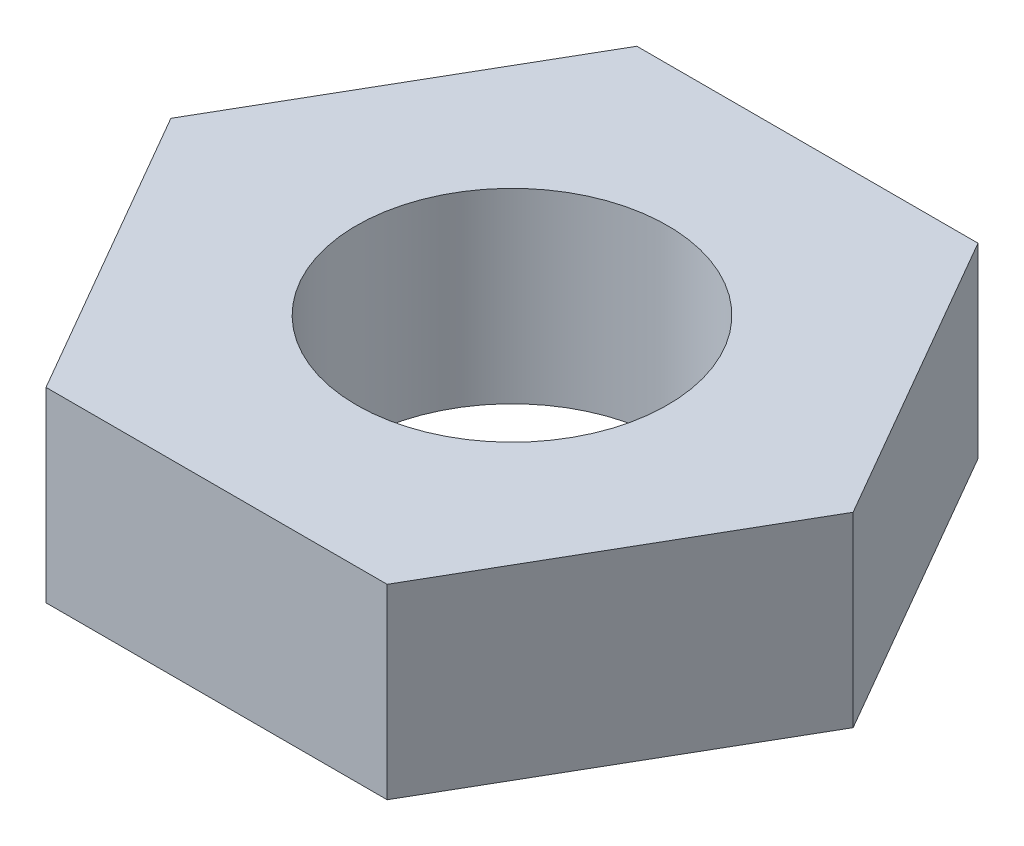
ISO-10303-21;
HEADER;
FILE_DESCRIPTION(('STEP AP214'),'2;1');
FILE_NAME('part.step','',(''),(''),'','','');
FILE_SCHEMA(('AUTOMOTIVE_DESIGN { 1 0 10303 214 1 1 1 1 }'));
ENDSEC;
DATA;
#1=APPLICATION_CONTEXT('core data for automotive mechanical design processes');
#2=APPLICATION_PROTOCOL_DEFINITION('international standard','automotive_design',2000,#1);
#3=PRODUCT_CONTEXT('',#1,'mechanical');
#4=PRODUCT('Part','Part','',(#3));
#5=PRODUCT_RELATED_PRODUCT_CATEGORY('part','',(#4));
#6=PRODUCT_DEFINITION_FORMATION('','',#4);
#7=PRODUCT_DEFINITION_CONTEXT('part definition',#1,'design');
#8=PRODUCT_DEFINITION('design','',#6,#7);
#9=PRODUCT_DEFINITION_SHAPE('','',#8);
#10=(LENGTH_UNIT() NAMED_UNIT(*) SI_UNIT(.MILLI.,.METRE.));
#11=(NAMED_UNIT(*) PLANE_ANGLE_UNIT() SI_UNIT($,.RADIAN.));
#12=(NAMED_UNIT(*) SI_UNIT($,.STERADIAN.) SOLID_ANGLE_UNIT());
#13=UNCERTAINTY_MEASURE_WITH_UNIT(LENGTH_MEASURE(1.E-05),#10,'distance_accuracy_value','');
#14=(GEOMETRIC_REPRESENTATION_CONTEXT(3) GLOBAL_UNCERTAINTY_ASSIGNED_CONTEXT((#13)) GLOBAL_UNIT_ASSIGNED_CONTEXT((#10,
#11,#12)) REPRESENTATION_CONTEXT('',''));
#15=CARTESIAN_POINT('',(0.,0.,0.));
#16=DIRECTION('',(0.,0.,1.));
#17=DIRECTION('',(1.,0.,0.));
#18=AXIS2_PLACEMENT_3D('',#15,#16,#17);
#19=CARTESIAN_POINT('',(0.,1.2,0.));
#20=DIRECTION('',(0.,1.,0.));
#21=DIRECTION('',(0.,0.,1.));
#22=AXIS2_PLACEMENT_3D('',#19,#20,#21);
#23=PLANE('',#22);
#24=DIRECTION('',(-0.5,0.,-0.866025403784438));
#25=VECTOR('',#24,1.);
#26=CARTESIAN_POINT('',(2.19393102292058,1.2,0.));
#27=LINE('',#26,#25);
#28=CARTESIAN_POINT('',(2.19393102292058,1.2,0.));
#29=VERTEX_POINT('',#28);
#30=CARTESIAN_POINT('',(1.09696551146029,1.2,-1.9));
#31=VERTEX_POINT('',#30);
#32=EDGE_CURVE('E128',#29,#31,#27,.T.);
#33=ORIENTED_EDGE('',*,*,#32,.T.);
#34=DIRECTION('',(-1.,0.,0.));
#35=VECTOR('',#34,1.);
#36=CARTESIAN_POINT('',(1.09696551146029,1.2,-1.9));
#37=LINE('',#36,#35);
#38=CARTESIAN_POINT('',(-1.09696551146029,1.2,-1.9));
#39=VERTEX_POINT('',#38);
#40=EDGE_CURVE('E86',#31,#39,#37,.T.);
#41=ORIENTED_EDGE('',*,*,#40,.T.);
#42=DIRECTION('',(-0.5,0.,0.866025403784439));
#43=VECTOR('',#42,1.);
#44=CARTESIAN_POINT('',(-1.09696551146029,1.2,-1.9));
#45=LINE('',#44,#43);
#46=CARTESIAN_POINT('',(-2.19393102292058,1.2,0.));
#47=VERTEX_POINT('',#46);
#48=EDGE_CURVE('E99',#39,#47,#45,.T.);
#49=ORIENTED_EDGE('',*,*,#48,.T.);
#50=DIRECTION('',(0.5,0.,0.866025403784439));
#51=VECTOR('',#50,1.);
#52=CARTESIAN_POINT('',(-2.19393102292058,1.2,0.));
#53=LINE('',#52,#51);
#54=CARTESIAN_POINT('',(-1.09696551146029,1.2,1.9));
#55=VERTEX_POINT('',#54);
#56=EDGE_CURVE('E93',#47,#55,#53,.T.);
#57=ORIENTED_EDGE('',*,*,#56,.T.);
#58=DIRECTION('',(1.,0.,0.));
#59=VECTOR('',#58,1.);
#60=CARTESIAN_POINT('',(-1.09696551146029,1.2,1.9));
#61=LINE('',#60,#59);
#62=CARTESIAN_POINT('',(1.09696551146029,1.2,1.9));
#63=VERTEX_POINT('',#62);
#64=EDGE_CURVE('E97',#55,#63,#61,.T.);
#65=ORIENTED_EDGE('',*,*,#64,.T.);
#66=DIRECTION('',(0.5,0.,-0.866025403784439));
#67=VECTOR('',#66,1.);
#68=CARTESIAN_POINT('',(1.09696551146029,1.2,1.9));
#69=LINE('',#68,#67);
#70=EDGE_CURVE('E49',#63,#29,#69,.T.);
#71=ORIENTED_EDGE('',*,*,#70,.T.);
#72=EDGE_LOOP('',(#33,#41,#49,#57,#65,#71));
#73=FACE_BOUND('',#72,.T.);
#74=CARTESIAN_POINT('',(0.,1.2,0.));
#75=DIRECTION('',(0.,1.,0.));
#76=DIRECTION('',(0.,0.,1.));
#77=AXIS2_PLACEMENT_3D('',#74,#75,#76);
#78=CIRCLE('',#77,1.);
#79=CARTESIAN_POINT('',(0.,1.2,1.));
#80=VERTEX_POINT('',#79);
#81=EDGE_CURVE('E121',#80,#80,#78,.T.);
#82=ORIENTED_EDGE('',*,*,#81,.F.);
#83=EDGE_LOOP('',(#82));
#84=FACE_BOUND('',#83,.T.);
#85=ADVANCED_FACE('F32',(#73,#84),#23,.T.);
#86=CARTESIAN_POINT('',(0.,0.,0.));
#87=DIRECTION('',(0.,1.,0.));
#88=DIRECTION('',(0.,0.,1.));
#89=AXIS2_PLACEMENT_3D('',#86,#87,#88);
#90=PLANE('',#89);
#91=DIRECTION('',(-0.5,0.,-0.866025403784438));
#92=VECTOR('',#91,1.);
#93=CARTESIAN_POINT('',(2.19393102292058,0.,0.));
#94=LINE('',#93,#92);
#95=CARTESIAN_POINT('',(2.19393102292058,0.,0.));
#96=VERTEX_POINT('',#95);
#97=CARTESIAN_POINT('',(1.09696551146029,0.,-1.9));
#98=VERTEX_POINT('',#97);
#99=EDGE_CURVE('E117',#96,#98,#94,.T.);
#100=ORIENTED_EDGE('',*,*,#99,.F.);
#101=DIRECTION('',(0.5,0.,-0.866025403784439));
#102=VECTOR('',#101,1.);
#103=CARTESIAN_POINT('',(1.09696551146029,0.,1.9));
#104=LINE('',#103,#102);
#105=CARTESIAN_POINT('',(1.09696551146029,0.,1.9));
#106=VERTEX_POINT('',#105);
#107=EDGE_CURVE('E78',#106,#96,#104,.T.);
#108=ORIENTED_EDGE('',*,*,#107,.F.);
#109=DIRECTION('',(1.,0.,0.));
#110=VECTOR('',#109,1.);
#111=CARTESIAN_POINT('',(-1.09696551146029,0.,1.9));
#112=LINE('',#111,#110);
#113=CARTESIAN_POINT('',(-1.09696551146029,0.,1.9));
#114=VERTEX_POINT('',#113);
#115=EDGE_CURVE('E72',#114,#106,#112,.T.);
#116=ORIENTED_EDGE('',*,*,#115,.F.);
#117=DIRECTION('',(0.5,0.,0.866025403784439));
#118=VECTOR('',#117,1.);
#119=CARTESIAN_POINT('',(-2.19393102292058,0.,0.));
#120=LINE('',#119,#118);
#121=CARTESIAN_POINT('',(-2.19393102292058,0.,0.));
#122=VERTEX_POINT('',#121);
#123=EDGE_CURVE('E107',#122,#114,#120,.T.);
#124=ORIENTED_EDGE('',*,*,#123,.F.);
#125=DIRECTION('',(-0.5,0.,0.866025403784439));
#126=VECTOR('',#125,1.);
#127=CARTESIAN_POINT('',(-1.09696551146029,0.,-1.9));
#128=LINE('',#127,#126);
#129=CARTESIAN_POINT('',(-1.09696551146029,0.,-1.9));
#130=VERTEX_POINT('',#129);
#131=EDGE_CURVE('E123',#130,#122,#128,.T.);
#132=ORIENTED_EDGE('',*,*,#131,.F.);
#133=DIRECTION('',(-1.,0.,0.));
#134=VECTOR('',#133,1.);
#135=CARTESIAN_POINT('',(1.09696551146029,0.,-1.9));
#136=LINE('',#135,#134);
#137=EDGE_CURVE('E120',#98,#130,#136,.T.);
#138=ORIENTED_EDGE('',*,*,#137,.F.);
#139=EDGE_LOOP('',(#100,#108,#116,#124,#132,#138));
#140=FACE_BOUND('',#139,.T.);
#141=CARTESIAN_POINT('',(0.,0.,0.));
#142=DIRECTION('',(0.,1.,0.));
#143=DIRECTION('',(0.,0.,1.));
#144=AXIS2_PLACEMENT_3D('',#141,#142,#143);
#145=CIRCLE('',#144,1.);
#146=CARTESIAN_POINT('',(0.,0.,1.));
#147=VERTEX_POINT('',#146);
#148=EDGE_CURVE('E221',#147,#147,#145,.T.);
#149=ORIENTED_EDGE('',*,*,#148,.T.);
#150=EDGE_LOOP('',(#149));
#151=FACE_BOUND('',#150,.T.);
#152=ADVANCED_FACE('F137',(#140,#151),#90,.F.);
#153=CARTESIAN_POINT('',(2.19393102292058,1.2,0.));
#154=DIRECTION('',(-0.866025403784438,0.,0.5));
#155=DIRECTION('',(0.5,0.,0.866025403784439));
#156=AXIS2_PLACEMENT_3D('',#153,#154,#155);
#157=PLANE('',#156);
#158=ORIENTED_EDGE('',*,*,#99,.T.);
#159=DIRECTION('',(0.,-1.,0.));
#160=VECTOR('',#159,1.);
#161=CARTESIAN_POINT('',(1.09696551146029,1.2,-1.9));
#162=LINE('',#161,#160);
#163=EDGE_CURVE('E11',#31,#98,#162,.T.);
#164=ORIENTED_EDGE('',*,*,#163,.F.);
#165=ORIENTED_EDGE('',*,*,#32,.F.);
#166=DIRECTION('',(0.,-1.,0.));
#167=VECTOR('',#166,1.);
#168=CARTESIAN_POINT('',(2.19393102292058,1.2,0.));
#169=LINE('',#168,#167);
#170=EDGE_CURVE('E113',#29,#96,#169,.T.);
#171=ORIENTED_EDGE('',*,*,#170,.T.);
#172=EDGE_LOOP('',(#158,#164,#165,#171));
#173=FACE_BOUND('',#172,.T.);
#174=ADVANCED_FACE('F34',(#173),#157,.F.);
#175=CARTESIAN_POINT('',(1.09696551146029,1.2,-1.9));
#176=DIRECTION('',(0.,0.,1.));
#177=DIRECTION('',(1.,0.,0.));
#178=AXIS2_PLACEMENT_3D('',#175,#176,#177);
#179=PLANE('',#178);
#180=ORIENTED_EDGE('',*,*,#137,.T.);
#181=DIRECTION('',(0.,-1.,0.));
#182=VECTOR('',#181,1.);
#183=CARTESIAN_POINT('',(-1.09696551146029,1.2,-1.9));
#184=LINE('',#183,#182);
#185=EDGE_CURVE('E41',#39,#130,#184,.T.);
#186=ORIENTED_EDGE('',*,*,#185,.F.);
#187=ORIENTED_EDGE('',*,*,#40,.F.);
#188=ORIENTED_EDGE('',*,*,#163,.T.);
#189=EDGE_LOOP('',(#180,#186,#187,#188));
#190=FACE_BOUND('',#189,.T.);
#191=ADVANCED_FACE('F162',(#190),#179,.F.);
#192=CARTESIAN_POINT('',(-1.09696551146029,1.2,-1.9));
#193=DIRECTION('',(0.866025403784439,0.,0.5));
#194=DIRECTION('',(0.5,0.,-0.866025403784439));
#195=AXIS2_PLACEMENT_3D('',#192,#193,#194);
#196=PLANE('',#195);
#197=ORIENTED_EDGE('',*,*,#131,.T.);
#198=DIRECTION('',(0.,-1.,0.));
#199=VECTOR('',#198,1.);
#200=CARTESIAN_POINT('',(-2.19393102292058,1.2,0.));
#201=LINE('',#200,#199);
#202=EDGE_CURVE('E108',#47,#122,#201,.T.);
#203=ORIENTED_EDGE('',*,*,#202,.F.);
#204=ORIENTED_EDGE('',*,*,#48,.F.);
#205=ORIENTED_EDGE('',*,*,#185,.T.);
#206=EDGE_LOOP('',(#197,#203,#204,#205));
#207=FACE_BOUND('',#206,.T.);
#208=ADVANCED_FACE('F134',(#207),#196,.F.);
#209=CARTESIAN_POINT('',(-2.19393102292058,1.2,0.));
#210=DIRECTION('',(0.866025403784439,0.,-0.5));
#211=DIRECTION('',(-0.5,0.,-0.866025403784439));
#212=AXIS2_PLACEMENT_3D('',#209,#210,#211);
#213=PLANE('',#212);
#214=ORIENTED_EDGE('',*,*,#123,.T.);
#215=DIRECTION('',(0.,-1.,0.));
#216=VECTOR('',#215,1.);
#217=CARTESIAN_POINT('',(-1.09696551146029,1.2,1.9));
#218=LINE('',#217,#216);
#219=EDGE_CURVE('E104',#55,#114,#218,.T.);
#220=ORIENTED_EDGE('',*,*,#219,.F.);
#221=ORIENTED_EDGE('',*,*,#56,.F.);
#222=ORIENTED_EDGE('',*,*,#202,.T.);
#223=EDGE_LOOP('',(#214,#220,#221,#222));
#224=FACE_BOUND('',#223,.T.);
#225=ADVANCED_FACE('F105',(#224),#213,.F.);
#226=CARTESIAN_POINT('',(-1.09696551146029,1.2,1.9));
#227=DIRECTION('',(0.,0.,-1.));
#228=DIRECTION('',(-1.,0.,0.));
#229=AXIS2_PLACEMENT_3D('',#226,#227,#228);
#230=PLANE('',#229);
#231=ORIENTED_EDGE('',*,*,#115,.T.);
#232=DIRECTION('',(0.,-1.,0.));
#233=VECTOR('',#232,1.);
#234=CARTESIAN_POINT('',(1.09696551146029,1.2,1.9));
#235=LINE('',#234,#233);
#236=EDGE_CURVE('E109',#63,#106,#235,.T.);
#237=ORIENTED_EDGE('',*,*,#236,.F.);
#238=ORIENTED_EDGE('',*,*,#64,.F.);
#239=ORIENTED_EDGE('',*,*,#219,.T.);
#240=EDGE_LOOP('',(#231,#237,#238,#239));
#241=FACE_BOUND('',#240,.T.);
#242=ADVANCED_FACE('F111',(#241),#230,.F.);
#243=CARTESIAN_POINT('',(1.09696551146029,1.2,1.9));
#244=DIRECTION('',(-0.866025403784439,0.,-0.5));
#245=DIRECTION('',(-0.5,0.,0.866025403784439));
#246=AXIS2_PLACEMENT_3D('',#243,#244,#245);
#247=PLANE('',#246);
#248=ORIENTED_EDGE('',*,*,#107,.T.);
#249=ORIENTED_EDGE('',*,*,#170,.F.);
#250=ORIENTED_EDGE('',*,*,#70,.F.);
#251=ORIENTED_EDGE('',*,*,#236,.T.);
#252=EDGE_LOOP('',(#248,#249,#250,#251));
#253=FACE_BOUND('',#252,.T.);
#254=ADVANCED_FACE('F142',(#253),#247,.F.);
#255=CARTESIAN_POINT('',(0.,1.2,0.));
#256=DIRECTION('',(0.,-1.,0.));
#257=DIRECTION('',(0.,0.,-1.));
#258=AXIS2_PLACEMENT_3D('',#255,#256,#257);
#259=CYLINDRICAL_SURFACE('',#258,1.);
#260=ORIENTED_EDGE('',*,*,#81,.T.);
#261=EDGE_LOOP('',(#260));
#262=FACE_BOUND('',#261,.T.);
#263=ORIENTED_EDGE('',*,*,#148,.F.);
#264=EDGE_LOOP('',(#263));
#265=FACE_BOUND('',#264,.T.);
#266=ADVANCED_FACE('F144',(#262,#265),#259,.F.);
#267=CLOSED_SHELL('',(#85,#152,#174,#191,#208,#225,#242,#254,#266));
#268=MANIFOLD_SOLID_BREP('B2',#267);
#269=ADVANCED_BREP_SHAPE_REPRESENTATION('',(#18,#268),#14);
#270=SHAPE_DEFINITION_REPRESENTATION(#9,#269);
ENDSEC;
END-ISO-10303-21;
